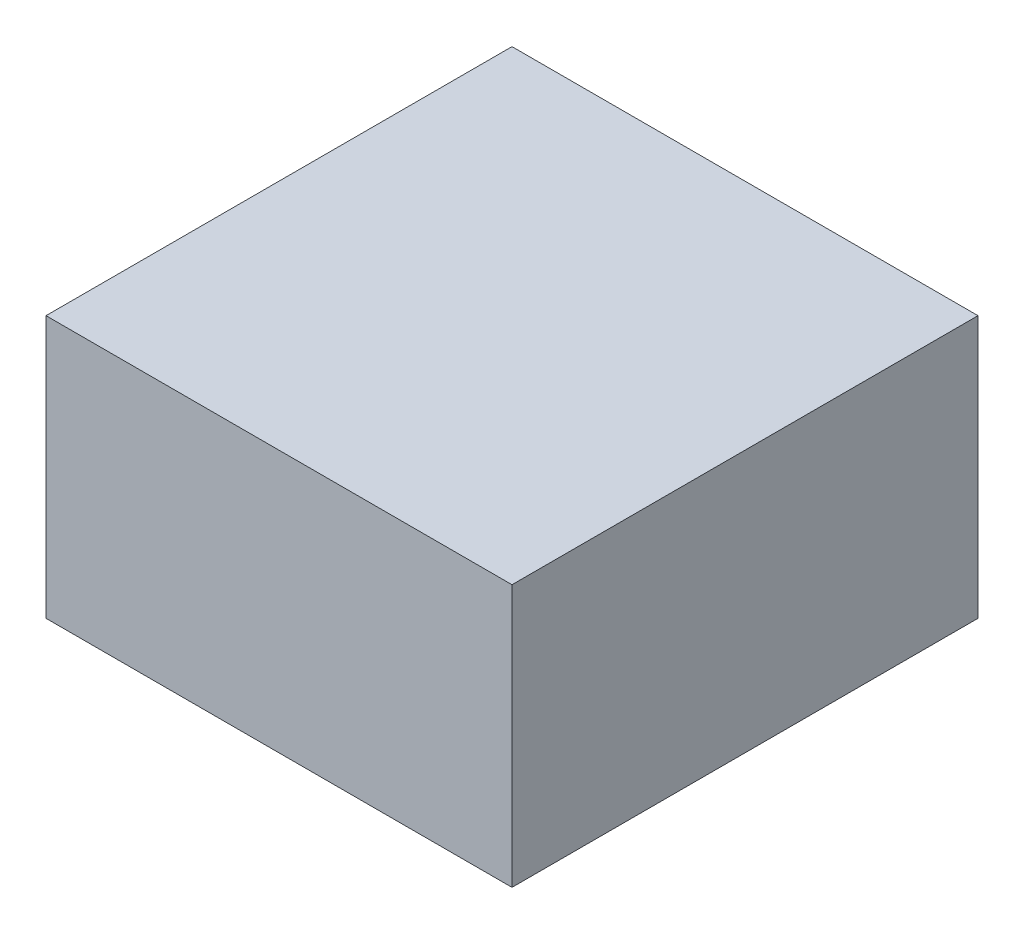
ISO-10303-21;
HEADER;
FILE_DESCRIPTION(('STEP AP214'),'2;1');
FILE_NAME('part.step','',(''),(''),'','','');
FILE_SCHEMA(('AUTOMOTIVE_DESIGN { 1 0 10303 214 1 1 1 1 }'));
ENDSEC;
DATA;
#1=APPLICATION_CONTEXT('core data for automotive mechanical design processes');
#2=APPLICATION_PROTOCOL_DEFINITION('international standard','automotive_design',2000,#1);
#3=PRODUCT_CONTEXT('',#1,'mechanical');
#4=PRODUCT('Part','Part','',(#3));
#5=PRODUCT_RELATED_PRODUCT_CATEGORY('part','',(#4));
#6=PRODUCT_DEFINITION_FORMATION('','',#4);
#7=PRODUCT_DEFINITION_CONTEXT('part definition',#1,'design');
#8=PRODUCT_DEFINITION('design','',#6,#7);
#9=PRODUCT_DEFINITION_SHAPE('','',#8);
#10=(LENGTH_UNIT() NAMED_UNIT(*) SI_UNIT(.MILLI.,.METRE.));
#11=(NAMED_UNIT(*) PLANE_ANGLE_UNIT() SI_UNIT($,.RADIAN.));
#12=(NAMED_UNIT(*) SI_UNIT($,.STERADIAN.) SOLID_ANGLE_UNIT());
#13=UNCERTAINTY_MEASURE_WITH_UNIT(LENGTH_MEASURE(1.E-05),#10,'distance_accuracy_value','');
#14=(GEOMETRIC_REPRESENTATION_CONTEXT(3) GLOBAL_UNCERTAINTY_ASSIGNED_CONTEXT((#13)) GLOBAL_UNIT_ASSIGNED_CONTEXT((#10,
#11,#12)) REPRESENTATION_CONTEXT('',''));
#15=CARTESIAN_POINT('',(0.,0.,0.));
#16=DIRECTION('',(0.,0.,1.));
#17=DIRECTION('',(1.,0.,0.));
#18=AXIS2_PLACEMENT_3D('',#15,#16,#17);
#19=CARTESIAN_POINT('',(25.4,28.575,-25.4));
#20=DIRECTION('',(-1.,0.,0.));
#21=DIRECTION('',(0.,0.,1.));
#22=AXIS2_PLACEMENT_3D('',#19,#20,#21);
#23=PLANE('',#22);
#24=DIRECTION('',(0.,0.,-1.));
#25=VECTOR('',#24,1.);
#26=CARTESIAN_POINT('',(25.4,0.,-25.4));
#27=LINE('',#26,#25);
#28=CARTESIAN_POINT('',(25.4,0.,25.4));
#29=VERTEX_POINT('',#28);
#30=CARTESIAN_POINT('',(25.4,0.,-25.4));
#31=VERTEX_POINT('',#30);
#32=EDGE_CURVE('E96',#29,#31,#27,.T.);
#33=ORIENTED_EDGE('',*,*,#32,.T.);
#34=DIRECTION('',(0.,-1.,0.));
#35=VECTOR('',#34,1.);
#36=CARTESIAN_POINT('',(25.4,28.575,-25.4));
#37=LINE('',#36,#35);
#38=CARTESIAN_POINT('',(25.4,28.575,-25.4));
#39=VERTEX_POINT('',#38);
#40=EDGE_CURVE('E11',#39,#31,#37,.T.);
#41=ORIENTED_EDGE('',*,*,#40,.F.);
#42=DIRECTION('',(0.,0.,-1.));
#43=VECTOR('',#42,1.);
#44=CARTESIAN_POINT('',(25.4,28.575,-25.4));
#45=LINE('',#44,#43);
#46=CARTESIAN_POINT('',(25.4,28.575,25.4));
#47=VERTEX_POINT('',#46);
#48=EDGE_CURVE('E84',#47,#39,#45,.T.);
#49=ORIENTED_EDGE('',*,*,#48,.F.);
#50=DIRECTION('',(0.,-1.,0.));
#51=VECTOR('',#50,1.);
#52=CARTESIAN_POINT('',(25.4,28.575,25.4));
#53=LINE('',#52,#51);
#54=EDGE_CURVE('E92',#47,#29,#53,.T.);
#55=ORIENTED_EDGE('',*,*,#54,.T.);
#56=EDGE_LOOP('',(#33,#41,#49,#55));
#57=FACE_BOUND('',#56,.T.);
#58=ADVANCED_FACE('F33',(#57),#23,.F.);
#59=CARTESIAN_POINT('',(-25.4,28.575,-25.4));
#60=DIRECTION('',(0.,0.,1.));
#61=DIRECTION('',(1.,0.,0.));
#62=AXIS2_PLACEMENT_3D('',#59,#60,#61);
#63=PLANE('',#62);
#64=DIRECTION('',(-1.,0.,0.));
#65=VECTOR('',#64,1.);
#66=CARTESIAN_POINT('',(-25.4,0.,-25.4));
#67=LINE('',#66,#65);
#68=CARTESIAN_POINT('',(-25.4,0.,-25.4));
#69=VERTEX_POINT('',#68);
#70=EDGE_CURVE('E88',#31,#69,#67,.T.);
#71=ORIENTED_EDGE('',*,*,#70,.T.);
#72=DIRECTION('',(0.,-1.,0.));
#73=VECTOR('',#72,1.);
#74=CARTESIAN_POINT('',(-25.4,28.575,-25.4));
#75=LINE('',#74,#73);
#76=CARTESIAN_POINT('',(-25.4,28.575,-25.4));
#77=VERTEX_POINT('',#76);
#78=EDGE_CURVE('E41',#77,#69,#75,.T.);
#79=ORIENTED_EDGE('',*,*,#78,.F.);
#80=DIRECTION('',(-1.,0.,0.));
#81=VECTOR('',#80,1.);
#82=CARTESIAN_POINT('',(-25.4,28.575,-25.4));
#83=LINE('',#82,#81);
#84=EDGE_CURVE('E79',#39,#77,#83,.T.);
#85=ORIENTED_EDGE('',*,*,#84,.F.);
#86=ORIENTED_EDGE('',*,*,#40,.T.);
#87=EDGE_LOOP('',(#71,#79,#85,#86));
#88=FACE_BOUND('',#87,.T.);
#89=ADVANCED_FACE('F87',(#88),#63,.F.);
#90=CARTESIAN_POINT('',(-25.4,28.575,-25.4));
#91=DIRECTION('',(1.,0.,0.));
#92=DIRECTION('',(0.,0.,-1.));
#93=AXIS2_PLACEMENT_3D('',#90,#91,#92);
#94=PLANE('',#93);
#95=DIRECTION('',(0.,0.,1.));
#96=VECTOR('',#95,1.);
#97=CARTESIAN_POINT('',(-25.4,0.,-25.4));
#98=LINE('',#97,#96);
#99=CARTESIAN_POINT('',(-25.4,0.,25.4));
#100=VERTEX_POINT('',#99);
#101=EDGE_CURVE('E66',#69,#100,#98,.T.);
#102=ORIENTED_EDGE('',*,*,#101,.T.);
#103=DIRECTION('',(0.,-1.,0.));
#104=VECTOR('',#103,1.);
#105=CARTESIAN_POINT('',(-25.4,28.575,25.4));
#106=LINE('',#105,#104);
#107=CARTESIAN_POINT('',(-25.4,28.575,25.4));
#108=VERTEX_POINT('',#107);
#109=EDGE_CURVE('E89',#108,#100,#106,.T.);
#110=ORIENTED_EDGE('',*,*,#109,.F.);
#111=DIRECTION('',(0.,0.,1.));
#112=VECTOR('',#111,1.);
#113=CARTESIAN_POINT('',(-25.4,28.575,-25.4));
#114=LINE('',#113,#112);
#115=EDGE_CURVE('E82',#77,#108,#114,.T.);
#116=ORIENTED_EDGE('',*,*,#115,.F.);
#117=ORIENTED_EDGE('',*,*,#78,.T.);
#118=EDGE_LOOP('',(#102,#110,#116,#117));
#119=FACE_BOUND('',#118,.T.);
#120=ADVANCED_FACE('F90',(#119),#94,.F.);
#121=CARTESIAN_POINT('',(-25.4,28.575,25.4));
#122=DIRECTION('',(0.,0.,-1.));
#123=DIRECTION('',(-1.,0.,0.));
#124=AXIS2_PLACEMENT_3D('',#121,#122,#123);
#125=PLANE('',#124);
#126=DIRECTION('',(1.,0.,0.));
#127=VECTOR('',#126,1.);
#128=CARTESIAN_POINT('',(-25.4,0.,25.4));
#129=LINE('',#128,#127);
#130=EDGE_CURVE('E72',#100,#29,#129,.T.);
#131=ORIENTED_EDGE('',*,*,#130,.T.);
#132=ORIENTED_EDGE('',*,*,#54,.F.);
#133=DIRECTION('',(1.,0.,0.));
#134=VECTOR('',#133,1.);
#135=CARTESIAN_POINT('',(-25.4,28.575,25.4));
#136=LINE('',#135,#134);
#137=EDGE_CURVE('E49',#108,#47,#136,.T.);
#138=ORIENTED_EDGE('',*,*,#137,.F.);
#139=ORIENTED_EDGE('',*,*,#109,.T.);
#140=EDGE_LOOP('',(#131,#132,#138,#139));
#141=FACE_BOUND('',#140,.T.);
#142=ADVANCED_FACE('F103',(#141),#125,.F.);
#143=CARTESIAN_POINT('',(0.,28.575,0.));
#144=DIRECTION('',(0.,1.,0.));
#145=DIRECTION('',(0.,0.,1.));
#146=AXIS2_PLACEMENT_3D('',#143,#144,#145);
#147=PLANE('',#146);
#148=ORIENTED_EDGE('',*,*,#48,.T.);
#149=ORIENTED_EDGE('',*,*,#84,.T.);
#150=ORIENTED_EDGE('',*,*,#115,.T.);
#151=ORIENTED_EDGE('',*,*,#137,.T.);
#152=EDGE_LOOP('',(#148,#149,#150,#151));
#153=FACE_BOUND('',#152,.T.);
#154=ADVANCED_FACE('F80',(#153),#147,.T.);
#155=CARTESIAN_POINT('',(0.,0.,0.));
#156=DIRECTION('',(0.,1.,0.));
#157=DIRECTION('',(0.,0.,1.));
#158=AXIS2_PLACEMENT_3D('',#155,#156,#157);
#159=PLANE('',#158);
#160=ORIENTED_EDGE('',*,*,#32,.F.);
#161=ORIENTED_EDGE('',*,*,#130,.F.);
#162=ORIENTED_EDGE('',*,*,#101,.F.);
#163=ORIENTED_EDGE('',*,*,#70,.F.);
#164=EDGE_LOOP('',(#160,#161,#162,#163));
#165=FACE_BOUND('',#164,.T.);
#166=ADVANCED_FACE('F106',(#165),#159,.F.);
#167=CLOSED_SHELL('',(#58,#89,#120,#142,#154,#166));
#168=MANIFOLD_SOLID_BREP('B2',#167);
#169=ADVANCED_BREP_SHAPE_REPRESENTATION('',(#18,#168),#14);
#170=SHAPE_DEFINITION_REPRESENTATION(#9,#169);
ENDSEC;
END-ISO-10303-21;
